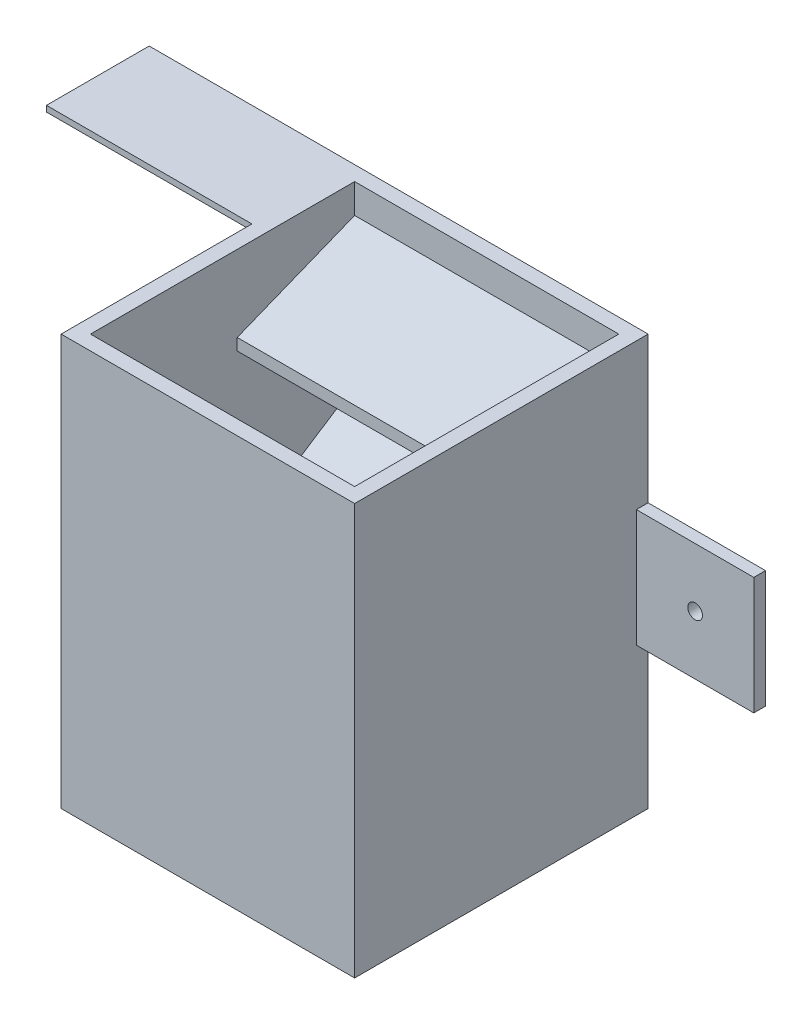
ISO-10303-21;
HEADER;
FILE_DESCRIPTION(('STEP AP214'),'2;1');
FILE_NAME('part.step','',(''),(''),'','','');
FILE_SCHEMA(('AUTOMOTIVE_DESIGN { 1 0 10303 214 1 1 1 1 }'));
ENDSEC;
DATA;
#1=APPLICATION_CONTEXT('core data for automotive mechanical design processes');
#2=APPLICATION_PROTOCOL_DEFINITION('international standard','automotive_design',2000,#1);
#3=PRODUCT_CONTEXT('',#1,'mechanical');
#4=PRODUCT('Part','Part','',(#3));
#5=PRODUCT_RELATED_PRODUCT_CATEGORY('part','',(#4));
#6=PRODUCT_DEFINITION_FORMATION('','',#4);
#7=PRODUCT_DEFINITION_CONTEXT('part definition',#1,'design');
#8=PRODUCT_DEFINITION('design','',#6,#7);
#9=PRODUCT_DEFINITION_SHAPE('','',#8);
#10=(LENGTH_UNIT() NAMED_UNIT(*) SI_UNIT(.MILLI.,.METRE.));
#11=(NAMED_UNIT(*) PLANE_ANGLE_UNIT() SI_UNIT($,.RADIAN.));
#12=(NAMED_UNIT(*) SI_UNIT($,.STERADIAN.) SOLID_ANGLE_UNIT());
#13=UNCERTAINTY_MEASURE_WITH_UNIT(LENGTH_MEASURE(1.E-05),#10,'distance_accuracy_value','');
#14=(GEOMETRIC_REPRESENTATION_CONTEXT(3) GLOBAL_UNCERTAINTY_ASSIGNED_CONTEXT((#13)) GLOBAL_UNIT_ASSIGNED_CONTEXT((#10,
#11,#12)) REPRESENTATION_CONTEXT('',''));
#15=CARTESIAN_POINT('',(0.,0.,0.));
#16=DIRECTION('',(0.,0.,1.));
#17=DIRECTION('',(1.,0.,0.));
#18=AXIS2_PLACEMENT_3D('',#15,#16,#17);
#19=CARTESIAN_POINT('',(13.8028169014084,70.,21.7781690140845));
#20=DIRECTION('',(-1.,0.,0.));
#21=DIRECTION('',(0.,0.,1.));
#22=AXIS2_PLACEMENT_3D('',#19,#20,#21);
#23=PLANE('',#22);
#24=DIRECTION('',(0.,0.,-1.));
#25=VECTOR('',#24,1.);
#26=CARTESIAN_POINT('',(13.8028169014084,25.1036447251014,-26.2218309859155));
#27=LINE('',#26,#25);
#28=CARTESIAN_POINT('',(13.8028169014084,25.1036447251014,-26.2218309859155));
#29=VERTEX_POINT('',#28);
#30=CARTESIAN_POINT('',(13.8028169014084,25.1036447251014,-28.2218309859155));
#31=VERTEX_POINT('',#30);
#32=EDGE_CURVE('E276',#29,#31,#27,.T.);
#33=ORIENTED_EDGE('',*,*,#32,.F.);
#34=DIRECTION('',(0.,1.,0.));
#35=VECTOR('',#34,1.);
#36=CARTESIAN_POINT('',(13.8028169014084,25.1036447251014,-26.2218309859155));
#37=LINE('',#36,#35);
#38=CARTESIAN_POINT('',(13.8028169014084,45.1036447251014,-26.2218309859155));
#39=VERTEX_POINT('',#38);
#40=EDGE_CURVE('E248',#29,#39,#37,.T.);
#41=ORIENTED_EDGE('',*,*,#40,.T.);
#42=DIRECTION('',(0.,0.,-1.));
#43=VECTOR('',#42,1.);
#44=CARTESIAN_POINT('',(13.8028169014084,45.1036447251014,-26.2218309859155));
#45=LINE('',#44,#43);
#46=CARTESIAN_POINT('',(13.8028169014084,45.1036447251014,-28.2218309859155));
#47=VERTEX_POINT('',#46);
#48=EDGE_CURVE('E260',#39,#47,#45,.T.);
#49=ORIENTED_EDGE('',*,*,#48,.T.);
#50=DIRECTION('',(0.,-1.,0.));
#51=VECTOR('',#50,1.);
#52=CARTESIAN_POINT('',(13.8028169014084,70.,-28.2218309859155));
#53=LINE('',#52,#51);
#54=CARTESIAN_POINT('',(13.8028169014084,70.,-28.2218309859155));
#55=VERTEX_POINT('',#54);
#56=EDGE_CURVE('E462',#55,#47,#53,.T.);
#57=ORIENTED_EDGE('',*,*,#56,.F.);
#58=DIRECTION('',(0.,0.,-1.));
#59=VECTOR('',#58,1.);
#60=CARTESIAN_POINT('',(13.8028169014084,70.,21.7781690140845));
#61=LINE('',#60,#59);
#62=CARTESIAN_POINT('',(13.8028169014084,70.,21.7781690140845));
#63=VERTEX_POINT('',#62);
#64=EDGE_CURVE('E451',#63,#55,#61,.T.);
#65=ORIENTED_EDGE('',*,*,#64,.F.);
#66=DIRECTION('',(0.,-1.,0.));
#67=VECTOR('',#66,1.);
#68=CARTESIAN_POINT('',(13.8028169014084,70.,21.7781690140845));
#69=LINE('',#68,#67);
#70=CARTESIAN_POINT('',(13.8028169014084,0.,21.7781690140845));
#71=VERTEX_POINT('',#70);
#72=EDGE_CURVE('E465',#63,#71,#69,.T.);
#73=ORIENTED_EDGE('',*,*,#72,.T.);
#74=DIRECTION('',(0.,0.,-1.));
#75=VECTOR('',#74,1.);
#76=CARTESIAN_POINT('',(13.8028169014084,0.,21.7781690140845));
#77=LINE('',#76,#75);
#78=CARTESIAN_POINT('',(13.8028169014084,0.,-28.2218309859155));
#79=VERTEX_POINT('',#78);
#80=EDGE_CURVE('E447',#71,#79,#77,.T.);
#81=ORIENTED_EDGE('',*,*,#80,.T.);
#82=EDGE_CURVE('E453',#31,#79,#53,.T.);
#83=ORIENTED_EDGE('',*,*,#82,.F.);
#84=EDGE_LOOP('',(#33,#41,#49,#57,#65,#73,#81,#83));
#85=FACE_BOUND('',#84,.T.);
#86=ADVANCED_FACE('F37',(#85),#23,.F.);
#87=CARTESIAN_POINT('',(-36.1971830985916,70.,-28.2218309859155));
#88=DIRECTION('',(1.,0.,0.));
#89=DIRECTION('',(0.,0.,-1.));
#90=AXIS2_PLACEMENT_3D('',#87,#88,#89);
#91=PLANE('',#90);
#92=DIRECTION('',(0.,-1.,0.));
#93=VECTOR('',#92,1.);
#94=CARTESIAN_POINT('',(-36.1971830985916,70.,-28.2218309859155));
#95=LINE('',#94,#93);
#96=CARTESIAN_POINT('',(-36.1971830985916,69.,-28.2218309859155));
#97=VERTEX_POINT('',#96);
#98=CARTESIAN_POINT('',(-36.1971830985916,45.1036447251014,-28.2218309859155));
#99=VERTEX_POINT('',#98);
#100=EDGE_CURVE('E472',#97,#99,#95,.T.);
#101=ORIENTED_EDGE('',*,*,#100,.T.);
#102=DIRECTION('',(0.,0.,-1.));
#103=VECTOR('',#102,1.);
#104=CARTESIAN_POINT('',(-36.1971830985916,45.1036447251014,-26.2218309859155));
#105=LINE('',#104,#103);
#106=CARTESIAN_POINT('',(-36.1971830985916,45.1036447251014,-26.2218309859155));
#107=VERTEX_POINT('',#106);
#108=EDGE_CURVE('E60',#107,#99,#105,.T.);
#109=ORIENTED_EDGE('',*,*,#108,.F.);
#110=DIRECTION('',(0.,-1.,0.));
#111=VECTOR('',#110,1.);
#112=CARTESIAN_POINT('',(-36.1971830985916,45.1036447251014,-26.2218309859155));
#113=LINE('',#112,#111);
#114=CARTESIAN_POINT('',(-36.1971830985916,25.1036447251014,-26.2218309859155));
#115=VERTEX_POINT('',#114);
#116=EDGE_CURVE('E285',#107,#115,#113,.T.);
#117=ORIENTED_EDGE('',*,*,#116,.T.);
#118=DIRECTION('',(0.,0.,-1.));
#119=VECTOR('',#118,1.);
#120=CARTESIAN_POINT('',(-36.1971830985916,25.1036447251014,-26.2218309859155));
#121=LINE('',#120,#119);
#122=CARTESIAN_POINT('',(-36.1971830985916,25.1036447251014,-28.2218309859155));
#123=VERTEX_POINT('',#122);
#124=EDGE_CURVE('E297',#115,#123,#121,.T.);
#125=ORIENTED_EDGE('',*,*,#124,.T.);
#126=CARTESIAN_POINT('',(-36.1971830985916,0.,-28.2218309859155));
#127=VERTEX_POINT('',#126);
#128=EDGE_CURVE('E471',#123,#127,#95,.T.);
#129=ORIENTED_EDGE('',*,*,#128,.T.);
#130=DIRECTION('',(0.,0.,1.));
#131=VECTOR('',#130,1.);
#132=CARTESIAN_POINT('',(-36.1971830985916,0.,-28.2218309859155));
#133=LINE('',#132,#131);
#134=CARTESIAN_POINT('',(-36.1971830985916,0.,21.7781690140845));
#135=VERTEX_POINT('',#134);
#136=EDGE_CURVE('E456',#127,#135,#133,.T.);
#137=ORIENTED_EDGE('',*,*,#136,.T.);
#138=DIRECTION('',(0.,-1.,0.));
#139=VECTOR('',#138,1.);
#140=CARTESIAN_POINT('',(-36.1971830985916,70.,21.7781690140845));
#141=LINE('',#140,#139);
#142=CARTESIAN_POINT('',(-36.1971830985916,70.,21.7781690140845));
#143=VERTEX_POINT('',#142);
#144=EDGE_CURVE('E468',#143,#135,#141,.T.);
#145=ORIENTED_EDGE('',*,*,#144,.F.);
#146=DIRECTION('',(0.,0.,1.));
#147=VECTOR('',#146,1.);
#148=CARTESIAN_POINT('',(-36.1971830985916,70.,-28.2218309859155));
#149=LINE('',#148,#147);
#150=CARTESIAN_POINT('',(-36.1971830985916,70.,-10.7218309859155));
#151=VERTEX_POINT('',#150);
#152=EDGE_CURVE('E446',#151,#143,#149,.T.);
#153=ORIENTED_EDGE('',*,*,#152,.F.);
#154=DIRECTION('',(0.,1.,0.));
#155=VECTOR('',#154,1.);
#156=CARTESIAN_POINT('',(-36.1971830985916,69.,-10.7218309859155));
#157=LINE('',#156,#155);
#158=CARTESIAN_POINT('',(-36.1971830985916,69.,-10.7218309859155));
#159=VERTEX_POINT('',#158);
#160=EDGE_CURVE('E331',#159,#151,#157,.T.);
#161=ORIENTED_EDGE('',*,*,#160,.F.);
#162=DIRECTION('',(0.,0.,-1.));
#163=VECTOR('',#162,1.);
#164=CARTESIAN_POINT('',(-36.1971830985916,69.,-28.2218309859155));
#165=LINE('',#164,#163);
#166=EDGE_CURVE('E313',#159,#97,#165,.T.);
#167=ORIENTED_EDGE('',*,*,#166,.T.);
#168=EDGE_LOOP('',(#101,#109,#117,#125,#129,#137,#145,#153,#161,#167));
#169=FACE_BOUND('',#168,.T.);
#170=ADVANCED_FACE('F553',(#169),#91,.F.);
#171=CARTESIAN_POINT('',(11.3028169014084,25.,-5.72183098591551));
#172=DIRECTION('',(0.,0.,-1.));
#173=DIRECTION('',(-1.,0.,0.));
#174=AXIS2_PLACEMENT_3D('',#171,#172,#173);
#175=PLANE('',#174);
#176=DIRECTION('',(-1.,0.,0.));
#177=VECTOR('',#176,1.);
#178=CARTESIAN_POINT('',(11.3028169014084,27.,-5.72183098591551));
#179=LINE('',#178,#177);
#180=CARTESIAN_POINT('',(11.3028169014084,27.,-5.72183098591551));
#181=VERTEX_POINT('',#180);
#182=CARTESIAN_POINT('',(-33.6971830985916,27.,-5.72183098591549));
#183=VERTEX_POINT('',#182);
#184=EDGE_CURVE('E347',#181,#183,#179,.T.);
#185=ORIENTED_EDGE('',*,*,#184,.T.);
#186=DIRECTION('',(0.,-1.,0.));
#187=VECTOR('',#186,1.);
#188=CARTESIAN_POINT('',(-33.6971830985916,25.,-5.72183098591549));
#189=LINE('',#188,#187);
#190=CARTESIAN_POINT('',(-33.6971830985916,25.,-5.72183098591549));
#191=VERTEX_POINT('',#190);
#192=EDGE_CURVE('E351',#183,#191,#189,.T.);
#193=ORIENTED_EDGE('',*,*,#192,.T.);
#194=DIRECTION('',(-1.,0.,0.));
#195=VECTOR('',#194,1.);
#196=CARTESIAN_POINT('',(11.3028169014084,25.,-5.72183098591551));
#197=LINE('',#196,#195);
#198=CARTESIAN_POINT('',(11.3028169014084,25.,-5.72183098591551));
#199=VERTEX_POINT('',#198);
#200=EDGE_CURVE('E360',#199,#191,#197,.T.);
#201=ORIENTED_EDGE('',*,*,#200,.F.);
#202=DIRECTION('',(0.,-1.,0.));
#203=VECTOR('',#202,1.);
#204=CARTESIAN_POINT('',(11.3028169014084,25.,-5.72183098591551));
#205=LINE('',#204,#203);
#206=EDGE_CURVE('E352',#181,#199,#205,.T.);
#207=ORIENTED_EDGE('',*,*,#206,.F.);
#208=EDGE_LOOP('',(#185,#193,#201,#207));
#209=FACE_BOUND('',#208,.T.);
#210=ADVANCED_FACE('F551',(#209),#175,.F.);
#211=CARTESIAN_POINT('',(-33.6971830985916,-60.,-25.7218309859155));
#212=DIRECTION('',(-1.,0.,0.));
#213=DIRECTION('',(0.,0.,1.));
#214=AXIS2_PLACEMENT_3D('',#211,#212,#213);
#215=PLANE('',#214);
#216=DIRECTION('',(0.,0.544988350595414,-0.838443616300637));
#217=VECTOR('',#216,1.);
#218=CARTESIAN_POINT('',(-33.6971830985916,40.,-25.7218309859155));
#219=LINE('',#218,#217);
#220=CARTESIAN_POINT('',(-33.6971830985916,40.,-25.7218309859155));
#221=VERTEX_POINT('',#220);
#222=EDGE_CURVE('E344',#183,#221,#219,.T.);
#223=ORIENTED_EDGE('',*,*,#222,.T.);
#224=DIRECTION('',(0.,1.,0.));
#225=VECTOR('',#224,1.);
#226=CARTESIAN_POINT('',(-33.6971830985916,-60.,-25.7218309859155));
#227=LINE('',#226,#225);
#228=CARTESIAN_POINT('',(-33.6971830985916,63.,-25.7218309859155));
#229=VERTEX_POINT('',#228);
#230=EDGE_CURVE('E433',#221,#229,#227,.T.);
#231=ORIENTED_EDGE('',*,*,#230,.T.);
#232=DIRECTION('',(0.,-0.371390676354104,0.928476690885259));
#233=VECTOR('',#232,1.);
#234=CARTESIAN_POINT('',(-33.6971830985916,63.,-25.7218309859155));
#235=LINE('',#234,#233);
#236=CARTESIAN_POINT('',(-33.6971830985916,55.,-5.7218309859155));
#237=VERTEX_POINT('',#236);
#238=EDGE_CURVE('E398',#229,#237,#235,.T.);
#239=ORIENTED_EDGE('',*,*,#238,.T.);
#240=DIRECTION('',(0.,-1.,0.));
#241=VECTOR('',#240,1.);
#242=CARTESIAN_POINT('',(-33.6971830985916,55.,-5.7218309859155));
#243=LINE('',#242,#241);
#244=CARTESIAN_POINT('',(-33.6971830985916,57.,-5.7218309859155));
#245=VERTEX_POINT('',#244);
#246=EDGE_CURVE('E406',#245,#237,#243,.T.);
#247=ORIENTED_EDGE('',*,*,#246,.F.);
#248=DIRECTION('',(0.,0.371390676354104,-0.928476690885259));
#249=VECTOR('',#248,1.);
#250=CARTESIAN_POINT('',(-33.6971830985916,57.,-5.7218309859155));
#251=LINE('',#250,#249);
#252=CARTESIAN_POINT('',(-33.6971830985916,65.,-25.7218309859155));
#253=VERTEX_POINT('',#252);
#254=EDGE_CURVE('E391',#245,#253,#251,.T.);
#255=ORIENTED_EDGE('',*,*,#254,.T.);
#256=CARTESIAN_POINT('',(-33.6971830985916,70.,-25.7218309859155));
#257=VERTEX_POINT('',#256);
#258=EDGE_CURVE('E434',#253,#257,#227,.T.);
#259=ORIENTED_EDGE('',*,*,#258,.T.);
#260=DIRECTION('',(0.,0.,1.));
#261=VECTOR('',#260,1.);
#262=CARTESIAN_POINT('',(-33.6971830985916,70.,-25.7218309859155));
#263=LINE('',#262,#261);
#264=CARTESIAN_POINT('',(-33.6971830985916,70.,19.2781690140845));
#265=VERTEX_POINT('',#264);
#266=EDGE_CURVE('E415',#257,#265,#263,.T.);
#267=ORIENTED_EDGE('',*,*,#266,.T.);
#268=DIRECTION('',(0.,1.,0.));
#269=VECTOR('',#268,1.);
#270=CARTESIAN_POINT('',(-33.6971830985916,-60.,19.2781690140845));
#271=LINE('',#270,#269);
#272=CARTESIAN_POINT('',(-33.6971830985916,55.,19.2781690140845));
#273=VERTEX_POINT('',#272);
#274=EDGE_CURVE('E429',#273,#265,#271,.T.);
#275=ORIENTED_EDGE('',*,*,#274,.F.);
#276=DIRECTION('',(0.,-0.544988350595414,-0.838443616300637));
#277=VECTOR('',#276,1.);
#278=CARTESIAN_POINT('',(-33.6971830985916,55.,19.2781690140845));
#279=LINE('',#278,#277);
#280=CARTESIAN_POINT('',(-33.6971830985916,42.,-0.72183098591549));
#281=VERTEX_POINT('',#280);
#282=EDGE_CURVE('E372',#273,#281,#279,.T.);
#283=ORIENTED_EDGE('',*,*,#282,.T.);
#284=DIRECTION('',(0.,1.,0.));
#285=VECTOR('',#284,1.);
#286=CARTESIAN_POINT('',(-33.6971830985916,40.,-0.72183098591549));
#287=LINE('',#286,#285);
#288=CARTESIAN_POINT('',(-33.6971830985916,40.,-0.721830985915488));
#289=VERTEX_POINT('',#288);
#290=EDGE_CURVE('E379',#289,#281,#287,.T.);
#291=ORIENTED_EDGE('',*,*,#290,.F.);
#292=DIRECTION('',(0.,0.544988350595414,0.838443616300637));
#293=VECTOR('',#292,1.);
#294=CARTESIAN_POINT('',(-33.6971830985916,53.,19.2781690140845));
#295=LINE('',#294,#293);
#296=CARTESIAN_POINT('',(-33.6971830985916,53.,19.2781690140845));
#297=VERTEX_POINT('',#296);
#298=EDGE_CURVE('E363',#289,#297,#295,.T.);
#299=ORIENTED_EDGE('',*,*,#298,.T.);
#300=CARTESIAN_POINT('',(-33.6971830985916,0.,19.2781690140845));
#301=VERTEX_POINT('',#300);
#302=EDGE_CURVE('E442',#301,#297,#271,.T.);
#303=ORIENTED_EDGE('',*,*,#302,.F.);
#304=DIRECTION('',(0.,0.,1.));
#305=VECTOR('',#304,1.);
#306=CARTESIAN_POINT('',(-33.6971830985916,0.,0.));
#307=LINE('',#306,#305);
#308=CARTESIAN_POINT('',(-33.6971830985916,0.,-25.7218309859155));
#309=VERTEX_POINT('',#308);
#310=EDGE_CURVE('E11',#309,#301,#307,.T.);
#311=ORIENTED_EDGE('',*,*,#310,.F.);
#312=CARTESIAN_POINT('',(-33.6971830985916,38.,-25.7218309859155));
#313=VERTEX_POINT('',#312);
#314=EDGE_CURVE('E430',#309,#313,#227,.T.);
#315=ORIENTED_EDGE('',*,*,#314,.T.);
#316=DIRECTION('',(0.,-0.544988350595414,0.838443616300637));
#317=VECTOR('',#316,1.);
#318=CARTESIAN_POINT('',(-33.6971830985916,38.,-25.7218309859155));
#319=LINE('',#318,#317);
#320=EDGE_CURVE('E333',#313,#191,#319,.T.);
#321=ORIENTED_EDGE('',*,*,#320,.T.);
#322=ORIENTED_EDGE('',*,*,#192,.F.);
#323=EDGE_LOOP('',(#223,#231,#239,#247,#255,#259,#267,#275,#283,#291,#299,#303,#311,#315,#321,#322));
#324=FACE_BOUND('',#323,.T.);
#325=ADVANCED_FACE('F501',(#324),#215,.F.);
#326=CARTESIAN_POINT('',(11.3028169014085,-60.,19.2781690140845));
#327=DIRECTION('',(1.,0.,0.));
#328=DIRECTION('',(0.,0.,-1.));
#329=AXIS2_PLACEMENT_3D('',#326,#327,#328);
#330=PLANE('',#329);
#331=DIRECTION('',(0.,1.,0.));
#332=VECTOR('',#331,1.);
#333=CARTESIAN_POINT('',(11.3028169014084,-60.,-25.7218309859155));
#334=LINE('',#333,#332);
#335=CARTESIAN_POINT('',(11.3028169014084,40.,-25.7218309859155));
#336=VERTEX_POINT('',#335);
#337=CARTESIAN_POINT('',(11.3028169014084,63.,-25.7218309859155));
#338=VERTEX_POINT('',#337);
#339=EDGE_CURVE('E437',#336,#338,#334,.T.);
#340=ORIENTED_EDGE('',*,*,#339,.F.);
#341=DIRECTION('',(0.,0.544988350595414,-0.838443616300637));
#342=VECTOR('',#341,1.);
#343=CARTESIAN_POINT('',(11.3028169014084,40.,-25.7218309859155));
#344=LINE('',#343,#342);
#345=EDGE_CURVE('E345',#181,#336,#344,.T.);
#346=ORIENTED_EDGE('',*,*,#345,.F.);
#347=ORIENTED_EDGE('',*,*,#206,.T.);
#348=DIRECTION('',(0.,-0.544988350595414,0.838443616300637));
#349=VECTOR('',#348,1.);
#350=CARTESIAN_POINT('',(11.3028169014084,38.,-25.7218309859155));
#351=LINE('',#350,#349);
#352=CARTESIAN_POINT('',(11.3028169014084,38.,-25.7218309859155));
#353=VERTEX_POINT('',#352);
#354=EDGE_CURVE('E338',#353,#199,#351,.T.);
#355=ORIENTED_EDGE('',*,*,#354,.F.);
#356=CARTESIAN_POINT('',(11.3028169014084,0.,-25.7218309859155));
#357=VERTEX_POINT('',#356);
#358=EDGE_CURVE('E435',#357,#353,#334,.T.);
#359=ORIENTED_EDGE('',*,*,#358,.F.);
#360=DIRECTION('',(0.,0.,-1.));
#361=VECTOR('',#360,1.);
#362=CARTESIAN_POINT('',(11.3028169014084,0.,0.));
#363=LINE('',#362,#361);
#364=CARTESIAN_POINT('',(11.3028169014085,0.,19.2781690140845));
#365=VERTEX_POINT('',#364);
#366=EDGE_CURVE('E477',#365,#357,#363,.T.);
#367=ORIENTED_EDGE('',*,*,#366,.F.);
#368=DIRECTION('',(0.,1.,0.));
#369=VECTOR('',#368,1.);
#370=CARTESIAN_POINT('',(11.3028169014085,-60.,19.2781690140845));
#371=LINE('',#370,#369);
#372=CARTESIAN_POINT('',(11.3028169014084,53.,19.2781690140845));
#373=VERTEX_POINT('',#372);
#374=EDGE_CURVE('E439',#365,#373,#371,.T.);
#375=ORIENTED_EDGE('',*,*,#374,.T.);
#376=DIRECTION('',(0.,0.544988350595414,0.838443616300637));
#377=VECTOR('',#376,1.);
#378=CARTESIAN_POINT('',(11.3028169014084,53.,19.2781690140845));
#379=LINE('',#378,#377);
#380=CARTESIAN_POINT('',(11.3028169014084,40.,-0.721830985915511));
#381=VERTEX_POINT('',#380);
#382=EDGE_CURVE('E364',#381,#373,#379,.T.);
#383=ORIENTED_EDGE('',*,*,#382,.F.);
#384=DIRECTION('',(0.,1.,0.));
#385=VECTOR('',#384,1.);
#386=CARTESIAN_POINT('',(11.3028169014084,40.,-0.721830985915509));
#387=LINE('',#386,#385);
#388=CARTESIAN_POINT('',(11.3028169014084,42.,-0.721830985915512));
#389=VERTEX_POINT('',#388);
#390=EDGE_CURVE('E380',#381,#389,#387,.T.);
#391=ORIENTED_EDGE('',*,*,#390,.T.);
#392=DIRECTION('',(0.,-0.544988350595414,-0.838443616300637));
#393=VECTOR('',#392,1.);
#394=CARTESIAN_POINT('',(11.3028169014084,55.,19.2781690140845));
#395=LINE('',#394,#393);
#396=CARTESIAN_POINT('',(11.3028169014084,55.,19.2781690140845));
#397=VERTEX_POINT('',#396);
#398=EDGE_CURVE('E373',#397,#389,#395,.T.);
#399=ORIENTED_EDGE('',*,*,#398,.F.);
#400=CARTESIAN_POINT('',(11.3028169014085,70.,19.2781690140845));
#401=VERTEX_POINT('',#400);
#402=EDGE_CURVE('E441',#397,#401,#371,.T.);
#403=ORIENTED_EDGE('',*,*,#402,.T.);
#404=DIRECTION('',(0.,0.,-1.));
#405=VECTOR('',#404,1.);
#406=CARTESIAN_POINT('',(11.3028169014085,70.,19.2781690140845));
#407=LINE('',#406,#405);
#408=CARTESIAN_POINT('',(11.3028169014084,70.,-25.7218309859155));
#409=VERTEX_POINT('',#408);
#410=EDGE_CURVE('E423',#401,#409,#407,.T.);
#411=ORIENTED_EDGE('',*,*,#410,.T.);
#412=CARTESIAN_POINT('',(11.3028169014084,65.,-25.7218309859155));
#413=VERTEX_POINT('',#412);
#414=EDGE_CURVE('E438',#413,#409,#334,.T.);
#415=ORIENTED_EDGE('',*,*,#414,.F.);
#416=DIRECTION('',(0.,0.371390676354104,-0.928476690885259));
#417=VECTOR('',#416,1.);
#418=CARTESIAN_POINT('',(11.3028169014084,57.,-5.72183098591552));
#419=LINE('',#418,#417);
#420=CARTESIAN_POINT('',(11.3028169014084,57.,-5.72183098591552));
#421=VERTEX_POINT('',#420);
#422=EDGE_CURVE('E392',#421,#413,#419,.T.);
#423=ORIENTED_EDGE('',*,*,#422,.F.);
#424=DIRECTION('',(0.,1.,0.));
#425=VECTOR('',#424,1.);
#426=CARTESIAN_POINT('',(11.3028169014084,65.,-5.7218309859155));
#427=LINE('',#426,#425);
#428=CARTESIAN_POINT('',(11.3028169014084,55.,-5.7218309859155));
#429=VERTEX_POINT('',#428);
#430=EDGE_CURVE('E412',#429,#421,#427,.T.);
#431=ORIENTED_EDGE('',*,*,#430,.F.);
#432=DIRECTION('',(0.,-0.371390676354104,0.928476690885259));
#433=VECTOR('',#432,1.);
#434=CARTESIAN_POINT('',(11.3028169014084,63.,-25.7218309859155));
#435=LINE('',#434,#433);
#436=EDGE_CURVE('E399',#338,#429,#435,.T.);
#437=ORIENTED_EDGE('',*,*,#436,.F.);
#438=EDGE_LOOP('',(#340,#346,#347,#355,#359,#367,#375,#383,#391,#399,#403,#411,#415,#423,#431,#437));
#439=FACE_BOUND('',#438,.T.);
#440=ADVANCED_FACE('F492',(#439),#330,.F.);
#441=CARTESIAN_POINT('',(11.3028169014084,-60.,-25.7218309859155));
#442=DIRECTION('',(0.,0.,-1.));
#443=DIRECTION('',(-1.,0.,0.));
#444=AXIS2_PLACEMENT_3D('',#441,#442,#443);
#445=PLANE('',#444);
#446=DIRECTION('',(-1.,0.,0.));
#447=VECTOR('',#446,1.);
#448=CARTESIAN_POINT('',(11.3028169014084,40.,-25.7218309859155));
#449=LINE('',#448,#447);
#450=EDGE_CURVE('E355',#336,#221,#449,.T.);
#451=ORIENTED_EDGE('',*,*,#450,.F.);
#452=ORIENTED_EDGE('',*,*,#339,.T.);
#453=DIRECTION('',(-1.,0.,0.));
#454=VECTOR('',#453,1.);
#455=CARTESIAN_POINT('',(11.3028169014084,63.,-25.7218309859155));
#456=LINE('',#455,#454);
#457=EDGE_CURVE('E401',#338,#229,#456,.T.);
#458=ORIENTED_EDGE('',*,*,#457,.T.);
#459=ORIENTED_EDGE('',*,*,#230,.F.);
#460=EDGE_LOOP('',(#451,#452,#458,#459));
#461=FACE_BOUND('',#460,.T.);
#462=ADVANCED_FACE('F536',(#461),#445,.F.);
#463=ORIENTED_EDGE('',*,*,#358,.T.);
#464=DIRECTION('',(-1.,0.,0.));
#465=VECTOR('',#464,1.);
#466=CARTESIAN_POINT('',(11.3028169014084,38.,-25.7218309859155));
#467=LINE('',#466,#465);
#468=EDGE_CURVE('E340',#353,#313,#467,.T.);
#469=ORIENTED_EDGE('',*,*,#468,.T.);
#470=ORIENTED_EDGE('',*,*,#314,.F.);
#471=DIRECTION('',(-1.,0.,0.));
#472=VECTOR('',#471,1.);
#473=CARTESIAN_POINT('',(0.,0.,-25.7218309859155));
#474=LINE('',#473,#472);
#475=EDGE_CURVE('E45',#357,#309,#474,.T.);
#476=ORIENTED_EDGE('',*,*,#475,.F.);
#477=EDGE_LOOP('',(#463,#469,#470,#476));
#478=FACE_BOUND('',#477,.T.);
#479=ADVANCED_FACE('F487',(#478),#445,.F.);
#480=CARTESIAN_POINT('',(11.3028169014084,40.,-0.721830985915509));
#481=DIRECTION('',(0.,0.,1.));
#482=DIRECTION('',(1.,0.,0.));
#483=AXIS2_PLACEMENT_3D('',#480,#481,#482);
#484=PLANE('',#483);
#485=DIRECTION('',(-1.,0.,0.));
#486=VECTOR('',#485,1.);
#487=CARTESIAN_POINT('',(11.3028169014084,42.,-0.721830985915512));
#488=LINE('',#487,#486);
#489=EDGE_CURVE('E375',#389,#281,#488,.T.);
#490=ORIENTED_EDGE('',*,*,#489,.F.);
#491=ORIENTED_EDGE('',*,*,#390,.F.);
#492=DIRECTION('',(-1.,0.,0.));
#493=VECTOR('',#492,1.);
#494=CARTESIAN_POINT('',(11.3028169014084,40.,-0.721830985915509));
#495=LINE('',#494,#493);
#496=EDGE_CURVE('E383',#381,#289,#495,.T.);
#497=ORIENTED_EDGE('',*,*,#496,.T.);
#498=ORIENTED_EDGE('',*,*,#290,.T.);
#499=EDGE_LOOP('',(#490,#491,#497,#498));
#500=FACE_BOUND('',#499,.T.);
#501=ADVANCED_FACE('F513',(#500),#484,.F.);
#502=CARTESIAN_POINT('',(-33.6971830985916,-60.,19.2781690140845));
#503=DIRECTION('',(0.,0.,1.));
#504=DIRECTION('',(1.,0.,0.));
#505=AXIS2_PLACEMENT_3D('',#502,#503,#504);
#506=PLANE('',#505);
#507=DIRECTION('',(-1.,0.,0.));
#508=VECTOR('',#507,1.);
#509=CARTESIAN_POINT('',(11.3028169014084,55.,19.2781690140845));
#510=LINE('',#509,#508);
#511=EDGE_CURVE('E388',#397,#273,#510,.T.);
#512=ORIENTED_EDGE('',*,*,#511,.T.);
#513=ORIENTED_EDGE('',*,*,#274,.T.);
#514=DIRECTION('',(1.,0.,0.));
#515=VECTOR('',#514,1.);
#516=CARTESIAN_POINT('',(-33.6971830985916,70.,19.2781690140845));
#517=LINE('',#516,#515);
#518=EDGE_CURVE('E420',#265,#401,#517,.T.);
#519=ORIENTED_EDGE('',*,*,#518,.T.);
#520=ORIENTED_EDGE('',*,*,#402,.F.);
#521=EDGE_LOOP('',(#512,#513,#519,#520));
#522=FACE_BOUND('',#521,.T.);
#523=ADVANCED_FACE('F521',(#522),#506,.F.);
#524=ORIENTED_EDGE('',*,*,#302,.T.);
#525=DIRECTION('',(-1.,0.,0.));
#526=VECTOR('',#525,1.);
#527=CARTESIAN_POINT('',(11.3028169014084,53.,19.2781690140845));
#528=LINE('',#527,#526);
#529=EDGE_CURVE('E367',#373,#297,#528,.T.);
#530=ORIENTED_EDGE('',*,*,#529,.F.);
#531=ORIENTED_EDGE('',*,*,#374,.F.);
#532=DIRECTION('',(1.,0.,0.));
#533=VECTOR('',#532,1.);
#534=CARTESIAN_POINT('',(0.,0.,19.2781690140845));
#535=LINE('',#534,#533);
#536=EDGE_CURVE('E474',#301,#365,#535,.T.);
#537=ORIENTED_EDGE('',*,*,#536,.F.);
#538=EDGE_LOOP('',(#524,#530,#531,#537));
#539=FACE_BOUND('',#538,.T.);
#540=ADVANCED_FACE('F506',(#539),#506,.F.);
#541=CARTESIAN_POINT('',(0.,0.,-5.7218309859155));
#542=DIRECTION('',(0.,0.,-1.));
#543=DIRECTION('',(-1.,0.,0.));
#544=AXIS2_PLACEMENT_3D('',#541,#542,#543);
#545=PLANE('',#544);
#546=DIRECTION('',(-1.,0.,0.));
#547=VECTOR('',#546,1.);
#548=CARTESIAN_POINT('',(11.3028169014084,57.,-5.72183098591552));
#549=LINE('',#548,#547);
#550=EDGE_CURVE('E394',#421,#245,#549,.T.);
#551=ORIENTED_EDGE('',*,*,#550,.T.);
#552=ORIENTED_EDGE('',*,*,#246,.T.);
#553=DIRECTION('',(1.,0.,0.));
#554=VECTOR('',#553,1.);
#555=CARTESIAN_POINT('',(11.3028169014084,55.,-5.7218309859155));
#556=LINE('',#555,#554);
#557=EDGE_CURVE('E409',#237,#429,#556,.T.);
#558=ORIENTED_EDGE('',*,*,#557,.T.);
#559=ORIENTED_EDGE('',*,*,#430,.T.);
#560=EDGE_LOOP('',(#551,#552,#558,#559));
#561=FACE_BOUND('',#560,.T.);
#562=ADVANCED_FACE('F546',(#561),#545,.F.);
#563=DIRECTION('',(-1.,0.,0.));
#564=VECTOR('',#563,1.);
#565=CARTESIAN_POINT('',(-33.6971830985916,65.,-25.7218309859155));
#566=LINE('',#565,#564);
#567=EDGE_CURVE('E405',#413,#253,#566,.T.);
#568=ORIENTED_EDGE('',*,*,#567,.F.);
#569=ORIENTED_EDGE('',*,*,#414,.T.);
#570=DIRECTION('',(-1.,0.,0.));
#571=VECTOR('',#570,1.);
#572=CARTESIAN_POINT('',(11.3028169014084,70.,-25.7218309859155));
#573=LINE('',#572,#571);
#574=EDGE_CURVE('E426',#409,#257,#573,.T.);
#575=ORIENTED_EDGE('',*,*,#574,.T.);
#576=ORIENTED_EDGE('',*,*,#258,.F.);
#577=EDGE_LOOP('',(#568,#569,#575,#576));
#578=FACE_BOUND('',#577,.T.);
#579=ADVANCED_FACE('F532',(#578),#445,.F.);
#580=CARTESIAN_POINT('',(13.8028169014084,70.,-28.2218309859155));
#581=DIRECTION('',(0.,0.,1.));
#582=DIRECTION('',(1.,0.,0.));
#583=AXIS2_PLACEMENT_3D('',#580,#581,#582);
#584=PLANE('',#583);
#585=DIRECTION('',(-1.,0.,0.));
#586=VECTOR('',#585,1.);
#587=CARTESIAN_POINT('',(13.8028169014084,0.,-28.2218309859155));
#588=LINE('',#587,#586);
#589=EDGE_CURVE('E432',#79,#127,#588,.T.);
#590=ORIENTED_EDGE('',*,*,#589,.T.);
#591=ORIENTED_EDGE('',*,*,#128,.F.);
#592=DIRECTION('',(-1.,0.,0.));
#593=VECTOR('',#592,1.);
#594=CARTESIAN_POINT('',(-36.1971830985916,25.1036447251014,-28.2218309859155));
#595=LINE('',#594,#593);
#596=CARTESIAN_POINT('',(-56.1971830985916,25.1036447251014,-28.2218309859155));
#597=VERTEX_POINT('',#596);
#598=EDGE_CURVE('E282',#123,#597,#595,.T.);
#599=ORIENTED_EDGE('',*,*,#598,.T.);
#600=DIRECTION('',(0.,1.,0.));
#601=VECTOR('',#600,1.);
#602=CARTESIAN_POINT('',(-56.1971830985916,25.1036447251014,-28.2218309859155));
#603=LINE('',#602,#601);
#604=CARTESIAN_POINT('',(-56.1971830985916,45.1036447251014,-28.2218309859155));
#605=VERTEX_POINT('',#604);
#606=EDGE_CURVE('E300',#597,#605,#603,.T.);
#607=ORIENTED_EDGE('',*,*,#606,.T.);
#608=DIRECTION('',(1.,0.,0.));
#609=VECTOR('',#608,1.);
#610=CARTESIAN_POINT('',(-56.1971830985916,45.1036447251014,-28.2218309859155));
#611=LINE('',#610,#609);
#612=EDGE_CURVE('E288',#605,#99,#611,.T.);
#613=ORIENTED_EDGE('',*,*,#612,.T.);
#614=ORIENTED_EDGE('',*,*,#100,.F.);
#615=DIRECTION('',(-1.,0.,0.));
#616=VECTOR('',#615,1.);
#617=CARTESIAN_POINT('',(-71.1971830985916,69.,-28.2218309859154));
#618=LINE('',#617,#616);
#619=CARTESIAN_POINT('',(-71.1971830985916,69.,-28.2218309859154));
#620=VERTEX_POINT('',#619);
#621=EDGE_CURVE('E316',#97,#620,#618,.T.);
#622=ORIENTED_EDGE('',*,*,#621,.T.);
#623=DIRECTION('',(0.,1.,0.));
#624=VECTOR('',#623,1.);
#625=CARTESIAN_POINT('',(-71.1971830985916,69.,-28.2218309859154));
#626=LINE('',#625,#624);
#627=CARTESIAN_POINT('',(-71.1971830985916,70.,-28.2218309859154));
#628=VERTEX_POINT('',#627);
#629=EDGE_CURVE('E326',#620,#628,#626,.T.);
#630=ORIENTED_EDGE('',*,*,#629,.T.);
#631=DIRECTION('',(-1.,0.,0.));
#632=VECTOR('',#631,1.);
#633=CARTESIAN_POINT('',(13.8028169014084,70.,-28.2218309859155));
#634=LINE('',#633,#632);
#635=EDGE_CURVE('E444',#55,#628,#634,.T.);
#636=ORIENTED_EDGE('',*,*,#635,.F.);
#637=ORIENTED_EDGE('',*,*,#56,.T.);
#638=DIRECTION('',(1.,0.,0.));
#639=VECTOR('',#638,1.);
#640=CARTESIAN_POINT('',(13.8028169014084,45.1036447251014,-28.2218309859155));
#641=LINE('',#640,#639);
#642=CARTESIAN_POINT('',(33.8028169014084,45.1036447251014,-28.2218309859155));
#643=VERTEX_POINT('',#642);
#644=EDGE_CURVE('E52',#47,#643,#641,.T.);
#645=ORIENTED_EDGE('',*,*,#644,.T.);
#646=DIRECTION('',(0.,-1.,0.));
#647=VECTOR('',#646,1.);
#648=CARTESIAN_POINT('',(33.8028169014084,45.1036447251014,-28.2218309859155));
#649=LINE('',#648,#647);
#650=CARTESIAN_POINT('',(33.8028169014084,25.1036447251014,-28.2218309859155));
#651=VERTEX_POINT('',#650);
#652=EDGE_CURVE('E245',#643,#651,#649,.T.);
#653=ORIENTED_EDGE('',*,*,#652,.T.);
#654=DIRECTION('',(-1.,0.,0.));
#655=VECTOR('',#654,1.);
#656=CARTESIAN_POINT('',(33.8028169014084,25.1036447251014,-28.2218309859155));
#657=LINE('',#656,#655);
#658=EDGE_CURVE('E261',#651,#31,#657,.T.);
#659=ORIENTED_EDGE('',*,*,#658,.T.);
#660=ORIENTED_EDGE('',*,*,#82,.T.);
#661=EDGE_LOOP('',(#590,#591,#599,#607,#613,#614,#622,#630,#636,#637,#645,#653,#659,#660));
#662=FACE_BOUND('',#661,.T.);
#663=CARTESIAN_POINT('',(-46.1971830985916,35.1036447251014,-28.2218309859155));
#664=DIRECTION('',(0.,0.,-1.));
#665=DIRECTION('',(-1.,0.,0.));
#666=AXIS2_PLACEMENT_3D('',#663,#664,#665);
#667=CIRCLE('',#666,1.25);
#668=CARTESIAN_POINT('',(-47.4471830985916,35.1036447251014,-28.2218309859155));
#669=VERTEX_POINT('',#668);
#670=EDGE_CURVE('E275',#669,#669,#667,.T.);
#671=ORIENTED_EDGE('',*,*,#670,.F.);
#672=EDGE_LOOP('',(#671));
#673=FACE_BOUND('',#672,.T.);
#674=CARTESIAN_POINT('',(23.8028169014084,35.1036447251014,-28.2218309859155));
#675=DIRECTION('',(0.,0.,-1.));
#676=DIRECTION('',(-1.,0.,0.));
#677=AXIS2_PLACEMENT_3D('',#674,#675,#676);
#678=CIRCLE('',#677,1.25);
#679=CARTESIAN_POINT('',(22.5528169014084,35.1036447251014,-28.2218309859155));
#680=VERTEX_POINT('',#679);
#681=EDGE_CURVE('E266',#680,#680,#678,.T.);
#682=ORIENTED_EDGE('',*,*,#681,.F.);
#683=EDGE_LOOP('',(#682));
#684=FACE_BOUND('',#683,.T.);
#685=ADVANCED_FACE('F39',(#662,#673,#684),#584,.F.);
#686=CARTESIAN_POINT('',(-36.1971830985916,70.,21.7781690140845));
#687=DIRECTION('',(0.,0.,-1.));
#688=DIRECTION('',(-1.,0.,0.));
#689=AXIS2_PLACEMENT_3D('',#686,#687,#688);
#690=PLANE('',#689);
#691=DIRECTION('',(1.,0.,0.));
#692=VECTOR('',#691,1.);
#693=CARTESIAN_POINT('',(-36.1971830985916,0.,21.7781690140845));
#694=LINE('',#693,#692);
#695=EDGE_CURVE('E458',#135,#71,#694,.T.);
#696=ORIENTED_EDGE('',*,*,#695,.T.);
#697=ORIENTED_EDGE('',*,*,#72,.F.);
#698=DIRECTION('',(1.,0.,0.));
#699=VECTOR('',#698,1.);
#700=CARTESIAN_POINT('',(-36.1971830985916,70.,21.7781690140845));
#701=LINE('',#700,#699);
#702=EDGE_CURVE('E449',#143,#63,#701,.T.);
#703=ORIENTED_EDGE('',*,*,#702,.F.);
#704=ORIENTED_EDGE('',*,*,#144,.T.);
#705=EDGE_LOOP('',(#696,#697,#703,#704));
#706=FACE_BOUND('',#705,.T.);
#707=ADVANCED_FACE('F573',(#706),#690,.F.);
#708=CARTESIAN_POINT('',(0.,70.,0.));
#709=DIRECTION('',(0.,1.,0.));
#710=DIRECTION('',(0.,0.,1.));
#711=AXIS2_PLACEMENT_3D('',#708,#709,#710);
#712=PLANE('',#711);
#713=ORIENTED_EDGE('',*,*,#266,.F.);
#714=ORIENTED_EDGE('',*,*,#574,.F.);
#715=ORIENTED_EDGE('',*,*,#410,.F.);
#716=ORIENTED_EDGE('',*,*,#518,.F.);
#717=EDGE_LOOP('',(#713,#714,#715,#716));
#718=FACE_BOUND('',#717,.T.);
#719=ORIENTED_EDGE('',*,*,#635,.T.);
#720=DIRECTION('',(0.,0.,1.));
#721=VECTOR('',#720,1.);
#722=CARTESIAN_POINT('',(-71.1971830985916,70.,-10.7218309859155));
#723=LINE('',#722,#721);
#724=CARTESIAN_POINT('',(-71.1971830985916,70.,-10.7218309859155));
#725=VERTEX_POINT('',#724);
#726=EDGE_CURVE('E306',#628,#725,#723,.T.);
#727=ORIENTED_EDGE('',*,*,#726,.T.);
#728=DIRECTION('',(1.,0.,0.));
#729=VECTOR('',#728,1.);
#730=CARTESIAN_POINT('',(-36.1971830985916,70.,-10.7218309859155));
#731=LINE('',#730,#729);
#732=EDGE_CURVE('E317',#725,#151,#731,.T.);
#733=ORIENTED_EDGE('',*,*,#732,.T.);
#734=ORIENTED_EDGE('',*,*,#152,.T.);
#735=ORIENTED_EDGE('',*,*,#702,.T.);
#736=ORIENTED_EDGE('',*,*,#64,.T.);
#737=EDGE_LOOP('',(#719,#727,#733,#734,#735,#736));
#738=FACE_BOUND('',#737,.T.);
#739=ADVANCED_FACE('F527',(#718,#738),#712,.T.);
#740=CARTESIAN_POINT('',(0.,0.,0.));
#741=DIRECTION('',(0.,1.,0.));
#742=DIRECTION('',(0.,0.,1.));
#743=AXIS2_PLACEMENT_3D('',#740,#741,#742);
#744=PLANE('',#743);
#745=ORIENTED_EDGE('',*,*,#475,.T.);
#746=ORIENTED_EDGE('',*,*,#310,.T.);
#747=ORIENTED_EDGE('',*,*,#536,.T.);
#748=ORIENTED_EDGE('',*,*,#366,.T.);
#749=EDGE_LOOP('',(#745,#746,#747,#748));
#750=FACE_BOUND('',#749,.T.);
#751=ORIENTED_EDGE('',*,*,#589,.F.);
#752=ORIENTED_EDGE('',*,*,#80,.F.);
#753=ORIENTED_EDGE('',*,*,#695,.F.);
#754=ORIENTED_EDGE('',*,*,#136,.F.);
#755=EDGE_LOOP('',(#751,#752,#753,#754));
#756=FACE_BOUND('',#755,.T.);
#757=ADVANCED_FACE('F481',(#750,#756),#744,.F.);
#758=CARTESIAN_POINT('',(11.3028169014084,63.,-25.7218309859155));
#759=DIRECTION('',(0.,-0.928476690885259,-0.371390676354104));
#760=DIRECTION('',(0.,0.371390676354104,-0.928476690885259));
#761=AXIS2_PLACEMENT_3D('',#758,#759,#760);
#762=PLANE('',#761);
#763=ORIENTED_EDGE('',*,*,#238,.F.);
#764=ORIENTED_EDGE('',*,*,#457,.F.);
#765=ORIENTED_EDGE('',*,*,#436,.T.);
#766=ORIENTED_EDGE('',*,*,#557,.F.);
#767=EDGE_LOOP('',(#763,#764,#765,#766));
#768=FACE_BOUND('',#767,.T.);
#769=ADVANCED_FACE('F541',(#768),#762,.T.);
#770=CARTESIAN_POINT('',(11.3028169014084,57.,-5.72183098591552));
#771=DIRECTION('',(0.,0.928476690885259,0.371390676354104));
#772=DIRECTION('',(0.,-0.371390676354104,0.928476690885259));
#773=AXIS2_PLACEMENT_3D('',#770,#771,#772);
#774=PLANE('',#773);
#775=ORIENTED_EDGE('',*,*,#254,.F.);
#776=ORIENTED_EDGE('',*,*,#550,.F.);
#777=ORIENTED_EDGE('',*,*,#422,.T.);
#778=ORIENTED_EDGE('',*,*,#567,.T.);
#779=EDGE_LOOP('',(#775,#776,#777,#778));
#780=FACE_BOUND('',#779,.T.);
#781=ADVANCED_FACE('F774',(#780),#774,.T.);
#782=CARTESIAN_POINT('',(11.3028169014084,55.,19.2781690140845));
#783=DIRECTION('',(0.,0.838443616300637,-0.544988350595414));
#784=DIRECTION('',(0.,0.544988350595414,0.838443616300637));
#785=AXIS2_PLACEMENT_3D('',#782,#783,#784);
#786=PLANE('',#785);
#787=ORIENTED_EDGE('',*,*,#282,.F.);
#788=ORIENTED_EDGE('',*,*,#511,.F.);
#789=ORIENTED_EDGE('',*,*,#398,.T.);
#790=ORIENTED_EDGE('',*,*,#489,.T.);
#791=EDGE_LOOP('',(#787,#788,#789,#790));
#792=FACE_BOUND('',#791,.T.);
#793=ADVANCED_FACE('F515',(#792),#786,.T.);
#794=CARTESIAN_POINT('',(11.3028169014084,53.,19.2781690140845));
#795=DIRECTION('',(0.,-0.838443616300637,0.544988350595414));
#796=DIRECTION('',(0.,-0.544988350595414,-0.838443616300637));
#797=AXIS2_PLACEMENT_3D('',#794,#795,#796);
#798=PLANE('',#797);
#799=ORIENTED_EDGE('',*,*,#298,.F.);
#800=ORIENTED_EDGE('',*,*,#496,.F.);
#801=ORIENTED_EDGE('',*,*,#382,.T.);
#802=ORIENTED_EDGE('',*,*,#529,.T.);
#803=EDGE_LOOP('',(#799,#800,#801,#802));
#804=FACE_BOUND('',#803,.T.);
#805=ADVANCED_FACE('F508',(#804),#798,.T.);
#806=CARTESIAN_POINT('',(11.3028169014084,38.,-25.7218309859155));
#807=DIRECTION('',(0.,-0.838443616300637,-0.544988350595414));
#808=DIRECTION('',(0.,0.544988350595414,-0.838443616300637));
#809=AXIS2_PLACEMENT_3D('',#806,#807,#808);
#810=PLANE('',#809);
#811=ORIENTED_EDGE('',*,*,#320,.F.);
#812=ORIENTED_EDGE('',*,*,#468,.F.);
#813=ORIENTED_EDGE('',*,*,#354,.T.);
#814=ORIENTED_EDGE('',*,*,#200,.T.);
#815=EDGE_LOOP('',(#811,#812,#813,#814));
#816=FACE_BOUND('',#815,.T.);
#817=ADVANCED_FACE('F498',(#816),#810,.T.);
#818=CARTESIAN_POINT('',(11.3028169014084,40.,-25.7218309859155));
#819=DIRECTION('',(0.,0.838443616300637,0.544988350595414));
#820=DIRECTION('',(0.,-0.544988350595414,0.838443616300637));
#821=AXIS2_PLACEMENT_3D('',#818,#819,#820);
#822=PLANE('',#821);
#823=ORIENTED_EDGE('',*,*,#222,.F.);
#824=ORIENTED_EDGE('',*,*,#184,.F.);
#825=ORIENTED_EDGE('',*,*,#345,.T.);
#826=ORIENTED_EDGE('',*,*,#450,.T.);
#827=EDGE_LOOP('',(#823,#824,#825,#826));
#828=FACE_BOUND('',#827,.T.);
#829=ADVANCED_FACE('F549',(#828),#822,.T.);
#830=CARTESIAN_POINT('',(-36.1971830985916,69.,-10.7218309859155));
#831=DIRECTION('',(0.,0.,1.));
#832=DIRECTION('',(1.,0.,0.));
#833=AXIS2_PLACEMENT_3D('',#830,#831,#832);
#834=PLANE('',#833);
#835=ORIENTED_EDGE('',*,*,#732,.F.);
#836=DIRECTION('',(0.,1.,0.));
#837=VECTOR('',#836,1.);
#838=CARTESIAN_POINT('',(-71.1971830985916,69.,-10.7218309859155));
#839=LINE('',#838,#837);
#840=CARTESIAN_POINT('',(-71.1971830985916,69.,-10.7218309859155));
#841=VERTEX_POINT('',#840);
#842=EDGE_CURVE('E334',#841,#725,#839,.T.);
#843=ORIENTED_EDGE('',*,*,#842,.F.);
#844=DIRECTION('',(1.,0.,0.));
#845=VECTOR('',#844,1.);
#846=CARTESIAN_POINT('',(-36.1971830985916,69.,-10.7218309859155));
#847=LINE('',#846,#845);
#848=EDGE_CURVE('E323',#841,#159,#847,.T.);
#849=ORIENTED_EDGE('',*,*,#848,.T.);
#850=ORIENTED_EDGE('',*,*,#160,.T.);
#851=EDGE_LOOP('',(#835,#843,#849,#850));
#852=FACE_BOUND('',#851,.T.);
#853=ADVANCED_FACE('F631',(#852),#834,.T.);
#854=CARTESIAN_POINT('',(-71.1971830985916,69.,-10.7218309859155));
#855=DIRECTION('',(-1.,0.,0.));
#856=DIRECTION('',(0.,0.,1.));
#857=AXIS2_PLACEMENT_3D('',#854,#855,#856);
#858=PLANE('',#857);
#859=ORIENTED_EDGE('',*,*,#726,.F.);
#860=ORIENTED_EDGE('',*,*,#629,.F.);
#861=DIRECTION('',(0.,0.,1.));
#862=VECTOR('',#861,1.);
#863=CARTESIAN_POINT('',(-71.1971830985916,69.,-10.7218309859155));
#864=LINE('',#863,#862);
#865=EDGE_CURVE('E320',#620,#841,#864,.T.);
#866=ORIENTED_EDGE('',*,*,#865,.T.);
#867=ORIENTED_EDGE('',*,*,#842,.T.);
#868=EDGE_LOOP('',(#859,#860,#866,#867));
#869=FACE_BOUND('',#868,.T.);
#870=ADVANCED_FACE('F629',(#869),#858,.T.);
#871=CARTESIAN_POINT('',(0.,69.,0.));
#872=DIRECTION('',(0.,-1.,0.));
#873=DIRECTION('',(0.,0.,-1.));
#874=AXIS2_PLACEMENT_3D('',#871,#872,#873);
#875=PLANE('',#874);
#876=ORIENTED_EDGE('',*,*,#166,.F.);
#877=ORIENTED_EDGE('',*,*,#848,.F.);
#878=ORIENTED_EDGE('',*,*,#865,.F.);
#879=ORIENTED_EDGE('',*,*,#621,.F.);
#880=EDGE_LOOP('',(#876,#877,#878,#879));
#881=FACE_BOUND('',#880,.T.);
#882=ADVANCED_FACE('F624',(#881),#875,.T.);
#883=CARTESIAN_POINT('',(-56.1971830985916,45.1036447251014,-26.2218309859155));
#884=DIRECTION('',(0.,1.,0.));
#885=DIRECTION('',(0.,0.,1.));
#886=AXIS2_PLACEMENT_3D('',#883,#884,#885);
#887=PLANE('',#886);
#888=ORIENTED_EDGE('',*,*,#612,.F.);
#889=DIRECTION('',(0.,0.,-1.));
#890=VECTOR('',#889,1.);
#891=CARTESIAN_POINT('',(-56.1971830985916,45.1036447251014,-26.2218309859155));
#892=LINE('',#891,#890);
#893=CARTESIAN_POINT('',(-56.1971830985916,45.1036447251014,-26.2218309859155));
#894=VERTEX_POINT('',#893);
#895=EDGE_CURVE('E307',#894,#605,#892,.T.);
#896=ORIENTED_EDGE('',*,*,#895,.F.);
#897=DIRECTION('',(1.,0.,0.));
#898=VECTOR('',#897,1.);
#899=CARTESIAN_POINT('',(-56.1971830985916,45.1036447251014,-26.2218309859155));
#900=LINE('',#899,#898);
#901=EDGE_CURVE('E294',#894,#107,#900,.T.);
#902=ORIENTED_EDGE('',*,*,#901,.T.);
#903=ORIENTED_EDGE('',*,*,#108,.T.);
#904=EDGE_LOOP('',(#888,#896,#902,#903));
#905=FACE_BOUND('',#904,.T.);
#906=ADVANCED_FACE('F611',(#905),#887,.T.);
#907=CARTESIAN_POINT('',(-56.1971830985916,25.1036447251014,-26.2218309859155));
#908=DIRECTION('',(-1.,0.,0.));
#909=DIRECTION('',(0.,0.,1.));
#910=AXIS2_PLACEMENT_3D('',#907,#908,#909);
#911=PLANE('',#910);
#912=ORIENTED_EDGE('',*,*,#606,.F.);
#913=DIRECTION('',(0.,0.,-1.));
#914=VECTOR('',#913,1.);
#915=CARTESIAN_POINT('',(-56.1971830985916,25.1036447251014,-26.2218309859155));
#916=LINE('',#915,#914);
#917=CARTESIAN_POINT('',(-56.1971830985916,25.1036447251014,-26.2218309859155));
#918=VERTEX_POINT('',#917);
#919=EDGE_CURVE('E309',#918,#597,#916,.T.);
#920=ORIENTED_EDGE('',*,*,#919,.F.);
#921=DIRECTION('',(0.,1.,0.));
#922=VECTOR('',#921,1.);
#923=CARTESIAN_POINT('',(-56.1971830985916,25.1036447251014,-26.2218309859155));
#924=LINE('',#923,#922);
#925=EDGE_CURVE('E291',#918,#894,#924,.T.);
#926=ORIENTED_EDGE('',*,*,#925,.T.);
#927=ORIENTED_EDGE('',*,*,#895,.T.);
#928=EDGE_LOOP('',(#912,#920,#926,#927));
#929=FACE_BOUND('',#928,.T.);
#930=ADVANCED_FACE('F616',(#929),#911,.T.);
#931=CARTESIAN_POINT('',(-36.1971830985916,25.1036447251014,-26.2218309859155));
#932=DIRECTION('',(0.,-1.,0.));
#933=DIRECTION('',(1.,0.,0.));
#934=AXIS2_PLACEMENT_3D('',#931,#932,#933);
#935=PLANE('',#934);
#936=ORIENTED_EDGE('',*,*,#598,.F.);
#937=ORIENTED_EDGE('',*,*,#124,.F.);
#938=DIRECTION('',(-1.,0.,0.));
#939=VECTOR('',#938,1.);
#940=CARTESIAN_POINT('',(-36.1971830985916,25.1036447251014,-26.2218309859155));
#941=LINE('',#940,#939);
#942=EDGE_CURVE('E287',#115,#918,#941,.T.);
#943=ORIENTED_EDGE('',*,*,#942,.T.);
#944=ORIENTED_EDGE('',*,*,#919,.T.);
#945=EDGE_LOOP('',(#936,#937,#943,#944));
#946=FACE_BOUND('',#945,.T.);
#947=ADVANCED_FACE('F605',(#946),#935,.T.);
#948=CARTESIAN_POINT('',(0.,0.,-26.2218309859155));
#949=DIRECTION('',(0.,0.,-1.));
#950=DIRECTION('',(-1.,0.,0.));
#951=AXIS2_PLACEMENT_3D('',#948,#949,#950);
#952=PLANE('',#951);
#953=CARTESIAN_POINT('',(-46.1971830985916,35.1036447251014,-26.2218309859155));
#954=DIRECTION('',(0.,0.,-1.));
#955=DIRECTION('',(-1.,0.,0.));
#956=AXIS2_PLACEMENT_3D('',#953,#954,#955);
#957=CIRCLE('',#956,1.25);
#958=CARTESIAN_POINT('',(-47.4471830985916,35.1036447251014,-26.2218309859155));
#959=VERTEX_POINT('',#958);
#960=EDGE_CURVE('E279',#959,#959,#957,.T.);
#961=ORIENTED_EDGE('',*,*,#960,.T.);
#962=EDGE_LOOP('',(#961));
#963=FACE_BOUND('',#962,.T.);
#964=ORIENTED_EDGE('',*,*,#116,.F.);
#965=ORIENTED_EDGE('',*,*,#901,.F.);
#966=ORIENTED_EDGE('',*,*,#925,.F.);
#967=ORIENTED_EDGE('',*,*,#942,.F.);
#968=EDGE_LOOP('',(#964,#965,#966,#967));
#969=FACE_BOUND('',#968,.T.);
#970=ADVANCED_FACE('F615',(#963,#969),#952,.F.);
#971=CARTESIAN_POINT('',(-46.1971830985916,35.1036447251014,-26.2218309859155));
#972=DIRECTION('',(0.,0.,-1.));
#973=DIRECTION('',(-1.,0.,0.));
#974=AXIS2_PLACEMENT_3D('',#971,#972,#973);
#975=CYLINDRICAL_SURFACE('',#974,1.25);
#976=ORIENTED_EDGE('',*,*,#960,.F.);
#977=EDGE_LOOP('',(#976));
#978=FACE_BOUND('',#977,.T.);
#979=ORIENTED_EDGE('',*,*,#670,.T.);
#980=EDGE_LOOP('',(#979));
#981=FACE_BOUND('',#980,.T.);
#982=ADVANCED_FACE('F693',(#978,#981),#975,.F.);
#983=CARTESIAN_POINT('',(13.8028169014084,45.1036447251014,-26.2218309859155));
#984=DIRECTION('',(0.,1.,0.));
#985=DIRECTION('',(0.,0.,1.));
#986=AXIS2_PLACEMENT_3D('',#983,#984,#985);
#987=PLANE('',#986);
#988=ORIENTED_EDGE('',*,*,#644,.F.);
#989=ORIENTED_EDGE('',*,*,#48,.F.);
#990=DIRECTION('',(1.,0.,0.));
#991=VECTOR('',#990,1.);
#992=CARTESIAN_POINT('',(13.8028169014084,45.1036447251014,-26.2218309859155));
#993=LINE('',#992,#991);
#994=CARTESIAN_POINT('',(33.8028169014084,45.1036447251014,-26.2218309859155));
#995=VERTEX_POINT('',#994);
#996=EDGE_CURVE('E255',#39,#995,#993,.T.);
#997=ORIENTED_EDGE('',*,*,#996,.T.);
#998=DIRECTION('',(0.,0.,-1.));
#999=VECTOR('',#998,1.);
#1000=CARTESIAN_POINT('',(33.8028169014084,45.1036447251014,-26.2218309859155));
#1001=LINE('',#1000,#999);
#1002=EDGE_CURVE('E240',#995,#643,#1001,.T.);
#1003=ORIENTED_EDGE('',*,*,#1002,.T.);
#1004=EDGE_LOOP('',(#988,#989,#997,#1003));
#1005=FACE_BOUND('',#1004,.T.);
#1006=ADVANCED_FACE('F259',(#1005),#987,.T.);
#1007=CARTESIAN_POINT('',(33.8028169014084,25.1036447251014,-26.2218309859155));
#1008=DIRECTION('',(0.,-1.,0.));
#1009=DIRECTION('',(0.,0.,-1.));
#1010=AXIS2_PLACEMENT_3D('',#1007,#1008,#1009);
#1011=PLANE('',#1010);
#1012=ORIENTED_EDGE('',*,*,#658,.F.);
#1013=DIRECTION('',(0.,0.,-1.));
#1014=VECTOR('',#1013,1.);
#1015=CARTESIAN_POINT('',(33.8028169014084,25.1036447251014,-26.2218309859155));
#1016=LINE('',#1015,#1014);
#1017=CARTESIAN_POINT('',(33.8028169014084,25.1036447251014,-26.2218309859155));
#1018=VERTEX_POINT('',#1017);
#1019=EDGE_CURVE('E247',#1018,#651,#1016,.T.);
#1020=ORIENTED_EDGE('',*,*,#1019,.F.);
#1021=DIRECTION('',(-1.,0.,0.));
#1022=VECTOR('',#1021,1.);
#1023=CARTESIAN_POINT('',(33.8028169014084,25.1036447251014,-26.2218309859155));
#1024=LINE('',#1023,#1022);
#1025=EDGE_CURVE('E257',#1018,#29,#1024,.T.);
#1026=ORIENTED_EDGE('',*,*,#1025,.T.);
#1027=ORIENTED_EDGE('',*,*,#32,.T.);
#1028=EDGE_LOOP('',(#1012,#1020,#1026,#1027));
#1029=FACE_BOUND('',#1028,.T.);
#1030=ADVANCED_FACE('F595',(#1029),#1011,.T.);
#1031=CARTESIAN_POINT('',(33.8028169014084,45.1036447251014,-26.2218309859155));
#1032=DIRECTION('',(1.,0.,0.));
#1033=DIRECTION('',(0.,1.,0.));
#1034=AXIS2_PLACEMENT_3D('',#1031,#1032,#1033);
#1035=PLANE('',#1034);
#1036=ORIENTED_EDGE('',*,*,#652,.F.);
#1037=ORIENTED_EDGE('',*,*,#1002,.F.);
#1038=DIRECTION('',(0.,-1.,0.));
#1039=VECTOR('',#1038,1.);
#1040=CARTESIAN_POINT('',(33.8028169014084,45.1036447251014,-26.2218309859155));
#1041=LINE('',#1040,#1039);
#1042=EDGE_CURVE('E243',#995,#1018,#1041,.T.);
#1043=ORIENTED_EDGE('',*,*,#1042,.T.);
#1044=ORIENTED_EDGE('',*,*,#1019,.T.);
#1045=EDGE_LOOP('',(#1036,#1037,#1043,#1044));
#1046=FACE_BOUND('',#1045,.T.);
#1047=ADVANCED_FACE('F242',(#1046),#1035,.T.);
#1048=CARTESIAN_POINT('',(0.,0.,-26.2218309859155));
#1049=DIRECTION('',(0.,0.,-1.));
#1050=DIRECTION('',(-1.,0.,0.));
#1051=AXIS2_PLACEMENT_3D('',#1048,#1049,#1050);
#1052=PLANE('',#1051);
#1053=CARTESIAN_POINT('',(23.8028169014084,35.1036447251014,-26.2218309859155));
#1054=DIRECTION('',(0.,0.,-1.));
#1055=DIRECTION('',(-1.,0.,0.));
#1056=AXIS2_PLACEMENT_3D('',#1053,#1054,#1055);
#1057=CIRCLE('',#1056,1.25);
#1058=CARTESIAN_POINT('',(22.5528169014084,35.1036447251014,-26.2218309859155));
#1059=VERTEX_POINT('',#1058);
#1060=EDGE_CURVE('E272',#1059,#1059,#1057,.T.);
#1061=ORIENTED_EDGE('',*,*,#1060,.T.);
#1062=EDGE_LOOP('',(#1061));
#1063=FACE_BOUND('',#1062,.T.);
#1064=ORIENTED_EDGE('',*,*,#996,.F.);
#1065=ORIENTED_EDGE('',*,*,#40,.F.);
#1066=ORIENTED_EDGE('',*,*,#1025,.F.);
#1067=ORIENTED_EDGE('',*,*,#1042,.F.);
#1068=EDGE_LOOP('',(#1064,#1065,#1066,#1067));
#1069=FACE_BOUND('',#1068,.T.);
#1070=ADVANCED_FACE('F253',(#1063,#1069),#1052,.F.);
#1071=CARTESIAN_POINT('',(23.8028169014084,35.1036447251014,-26.2218309859155));
#1072=DIRECTION('',(0.,0.,-1.));
#1073=DIRECTION('',(-1.,0.,0.));
#1074=AXIS2_PLACEMENT_3D('',#1071,#1072,#1073);
#1075=CYLINDRICAL_SURFACE('',#1074,1.25);
#1076=ORIENTED_EDGE('',*,*,#1060,.F.);
#1077=EDGE_LOOP('',(#1076));
#1078=FACE_BOUND('',#1077,.T.);
#1079=ORIENTED_EDGE('',*,*,#681,.T.);
#1080=EDGE_LOOP('',(#1079));
#1081=FACE_BOUND('',#1080,.T.);
#1082=ADVANCED_FACE('F725',(#1078,#1081),#1075,.F.);
#1083=CLOSED_SHELL('',(#86,#170,#210,#325,#440,#462,#479,#501,#523,#540,#562,#579,#685,#707,
#739,#757,#769,#781,#793,#805,#817,#829,#853,#870,#882,#906,#930,#947,#970,#982,#1006,#1030,
#1047,#1070,#1082));
#1084=MANIFOLD_SOLID_BREP('B2',#1083);
#1085=ADVANCED_BREP_SHAPE_REPRESENTATION('',(#18,#1084),#14);
#1086=SHAPE_DEFINITION_REPRESENTATION(#9,#1085);
ENDSEC;
END-ISO-10303-21;
